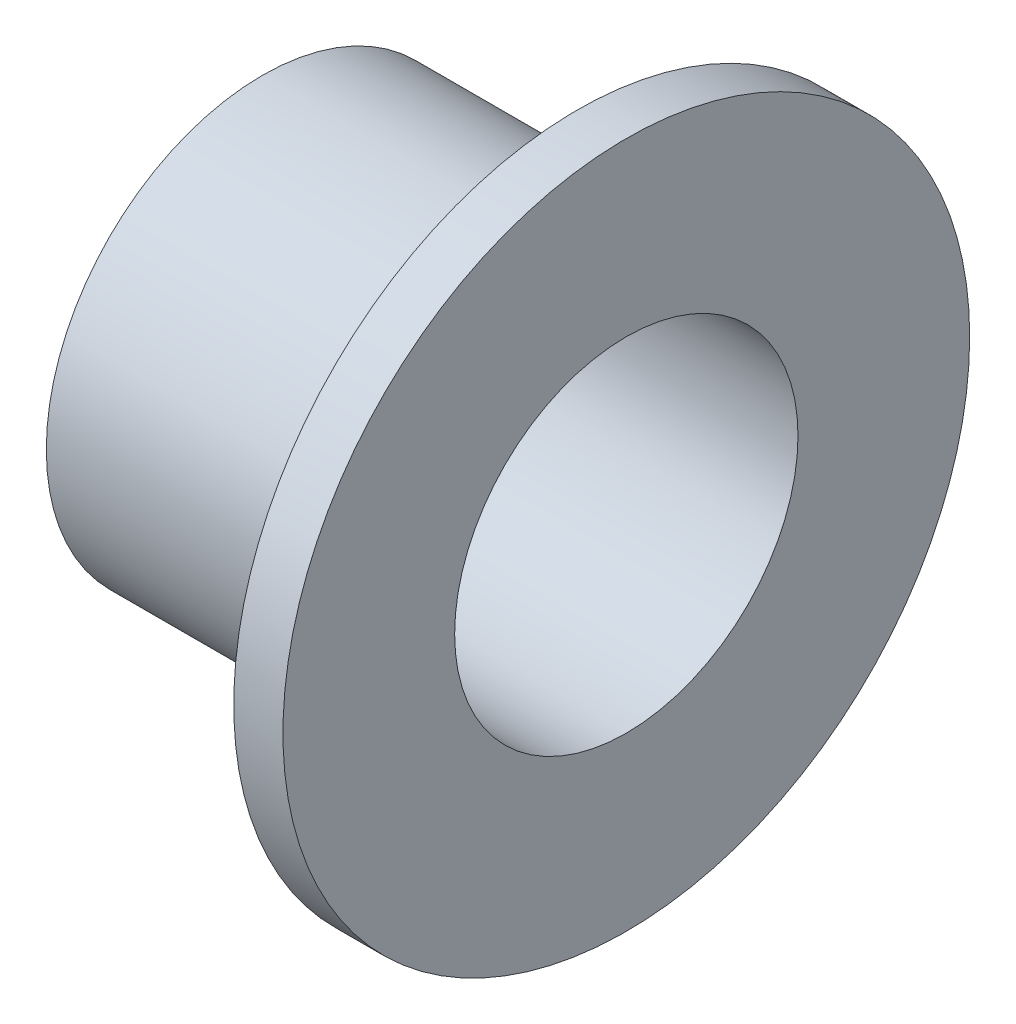
ISO-10303-21;
HEADER;
FILE_DESCRIPTION(('STEP AP214'),'2;1');
FILE_NAME('part.step','',(''),(''),'','','');
FILE_SCHEMA(('AUTOMOTIVE_DESIGN { 1 0 10303 214 1 1 1 1 }'));
ENDSEC;
DATA;
#1=APPLICATION_CONTEXT('core data for automotive mechanical design processes');
#2=APPLICATION_PROTOCOL_DEFINITION('international standard','automotive_design',2000,#1);
#3=PRODUCT_CONTEXT('',#1,'mechanical');
#4=PRODUCT('Part','Part','',(#3));
#5=PRODUCT_RELATED_PRODUCT_CATEGORY('part','',(#4));
#6=PRODUCT_DEFINITION_FORMATION('','',#4);
#7=PRODUCT_DEFINITION_CONTEXT('part definition',#1,'design');
#8=PRODUCT_DEFINITION('design','',#6,#7);
#9=PRODUCT_DEFINITION_SHAPE('','',#8);
#10=(LENGTH_UNIT() NAMED_UNIT(*) SI_UNIT(.MILLI.,.METRE.));
#11=(NAMED_UNIT(*) PLANE_ANGLE_UNIT() SI_UNIT($,.RADIAN.));
#12=(NAMED_UNIT(*) SI_UNIT($,.STERADIAN.) SOLID_ANGLE_UNIT());
#13=UNCERTAINTY_MEASURE_WITH_UNIT(LENGTH_MEASURE(1.E-05),#10,'distance_accuracy_value','');
#14=(GEOMETRIC_REPRESENTATION_CONTEXT(3) GLOBAL_UNCERTAINTY_ASSIGNED_CONTEXT((#13)) GLOBAL_UNIT_ASSIGNED_CONTEXT((#10,
#11,#12)) REPRESENTATION_CONTEXT('',''));
#15=CARTESIAN_POINT('',(0.,0.,0.));
#16=DIRECTION('',(0.,0.,1.));
#17=DIRECTION('',(1.,0.,0.));
#18=AXIS2_PLACEMENT_3D('',#15,#16,#17);
#19=CARTESIAN_POINT('',(5.50000000000006,6.66133814775094E-13,0.));
#20=DIRECTION('',(-1.,0.,0.));
#21=DIRECTION('',(0.,0.,1.));
#22=AXIS2_PLACEMENT_3D('',#19,#20,#21);
#23=CYLINDRICAL_SURFACE('',#22,3.775);
#24=CARTESIAN_POINT('',(5.50000000000006,6.66133814775094E-13,0.));
#25=DIRECTION('',(1.,0.,0.));
#26=DIRECTION('',(0.,0.,-1.));
#27=AXIS2_PLACEMENT_3D('',#24,#25,#26);
#28=CIRCLE('',#27,3.775);
#29=CARTESIAN_POINT('',(5.50000000000006,6.66133814775094E-13,-3.775));
#30=VERTEX_POINT('',#29);
#31=EDGE_CURVE('E10',#30,#30,#28,.T.);
#32=ORIENTED_EDGE('',*,*,#31,.F.);
#33=EDGE_LOOP('',(#32));
#34=FACE_BOUND('',#33,.T.);
#35=CARTESIAN_POINT('',(0.,0.,0.));
#36=DIRECTION('',(1.,0.,0.));
#37=DIRECTION('',(0.,0.,-1.));
#38=AXIS2_PLACEMENT_3D('',#35,#36,#37);
#39=CIRCLE('',#38,3.775);
#40=CARTESIAN_POINT('',(0.,0.,-3.775));
#41=VERTEX_POINT('',#40);
#42=EDGE_CURVE('E35',#41,#41,#39,.T.);
#43=ORIENTED_EDGE('',*,*,#42,.T.);
#44=EDGE_LOOP('',(#43));
#45=FACE_BOUND('',#44,.T.);
#46=ADVANCED_FACE('F32',(#34,#45),#23,.T.);
#47=CARTESIAN_POINT('',(0.,0.,0.));
#48=DIRECTION('',(1.,0.,0.));
#49=DIRECTION('',(0.,0.,-1.));
#50=AXIS2_PLACEMENT_3D('',#47,#48,#49);
#51=PLANE('',#50);
#52=CARTESIAN_POINT('',(0.,0.,0.));
#53=DIRECTION('',(1.,0.,0.));
#54=DIRECTION('',(0.,0.,-1.));
#55=AXIS2_PLACEMENT_3D('',#52,#53,#54);
#56=CIRCLE('',#55,3.);
#57=CARTESIAN_POINT('',(0.,0.,-3.));
#58=VERTEX_POINT('',#57);
#59=EDGE_CURVE('E47',#58,#58,#56,.T.);
#60=ORIENTED_EDGE('',*,*,#59,.T.);
#61=EDGE_LOOP('',(#60));
#62=FACE_BOUND('',#61,.T.);
#63=ORIENTED_EDGE('',*,*,#42,.F.);
#64=EDGE_LOOP('',(#63));
#65=FACE_BOUND('',#64,.T.);
#66=ADVANCED_FACE('F56',(#62,#65),#51,.F.);
#67=CARTESIAN_POINT('',(6.35999999999992,0.,0.));
#68=DIRECTION('',(-1.,0.,0.));
#69=DIRECTION('',(0.,0.,1.));
#70=AXIS2_PLACEMENT_3D('',#67,#68,#69);
#71=CYLINDRICAL_SURFACE('',#70,6.);
#72=CARTESIAN_POINT('',(6.35999999999992,0.,0.));
#73=DIRECTION('',(1.,0.,0.));
#74=DIRECTION('',(0.,0.,-1.));
#75=AXIS2_PLACEMENT_3D('',#72,#73,#74);
#76=CIRCLE('',#75,6.);
#77=CARTESIAN_POINT('',(6.35999999999992,0.,-6.));
#78=VERTEX_POINT('',#77);
#79=EDGE_CURVE('E42',#78,#78,#76,.T.);
#80=ORIENTED_EDGE('',*,*,#79,.F.);
#81=EDGE_LOOP('',(#80));
#82=FACE_BOUND('',#81,.T.);
#83=CARTESIAN_POINT('',(5.50000000000006,6.66133814775094E-13,0.));
#84=DIRECTION('',(1.,0.,0.));
#85=DIRECTION('',(0.,0.,-1.));
#86=AXIS2_PLACEMENT_3D('',#83,#84,#85);
#87=CIRCLE('',#86,6.);
#88=CARTESIAN_POINT('',(5.50000000000006,6.66133814775094E-13,-6.));
#89=VERTEX_POINT('',#88);
#90=EDGE_CURVE('E44',#89,#89,#87,.T.);
#91=ORIENTED_EDGE('',*,*,#90,.T.);
#92=EDGE_LOOP('',(#91));
#93=FACE_BOUND('',#92,.T.);
#94=ADVANCED_FACE('F69',(#82,#93),#71,.T.);
#95=CARTESIAN_POINT('',(6.35999999999992,0.,0.));
#96=DIRECTION('',(1.,0.,0.));
#97=DIRECTION('',(0.,0.,-1.));
#98=AXIS2_PLACEMENT_3D('',#95,#96,#97);
#99=PLANE('',#98);
#100=CARTESIAN_POINT('',(6.35999999999992,0.,0.));
#101=DIRECTION('',(1.,0.,0.));
#102=DIRECTION('',(0.,0.,-1.));
#103=AXIS2_PLACEMENT_3D('',#100,#101,#102);
#104=CIRCLE('',#103,3.);
#105=CARTESIAN_POINT('',(6.35999999999992,0.,-3.));
#106=VERTEX_POINT('',#105);
#107=EDGE_CURVE('E50',#106,#106,#104,.T.);
#108=ORIENTED_EDGE('',*,*,#107,.F.);
#109=EDGE_LOOP('',(#108));
#110=FACE_BOUND('',#109,.T.);
#111=ORIENTED_EDGE('',*,*,#79,.T.);
#112=EDGE_LOOP('',(#111));
#113=FACE_BOUND('',#112,.T.);
#114=ADVANCED_FACE('F66',(#110,#113),#99,.T.);
#115=CARTESIAN_POINT('',(5.50000000000006,6.66133814775094E-13,0.));
#116=DIRECTION('',(1.,0.,0.));
#117=DIRECTION('',(0.,0.,-1.));
#118=AXIS2_PLACEMENT_3D('',#115,#116,#117);
#119=PLANE('',#118);
#120=ORIENTED_EDGE('',*,*,#31,.T.);
#121=EDGE_LOOP('',(#120));
#122=FACE_BOUND('',#121,.T.);
#123=ORIENTED_EDGE('',*,*,#90,.F.);
#124=EDGE_LOOP('',(#123));
#125=FACE_BOUND('',#124,.T.);
#126=ADVANCED_FACE('F62',(#122,#125),#119,.F.);
#127=CARTESIAN_POINT('',(0.,0.,0.));
#128=DIRECTION('',(1.,0.,0.));
#129=DIRECTION('',(0.,0.,-1.));
#130=AXIS2_PLACEMENT_3D('',#127,#128,#129);
#131=CYLINDRICAL_SURFACE('',#130,3.);
#132=ORIENTED_EDGE('',*,*,#59,.F.);
#133=EDGE_LOOP('',(#132));
#134=FACE_BOUND('',#133,.T.);
#135=ORIENTED_EDGE('',*,*,#107,.T.);
#136=EDGE_LOOP('',(#135));
#137=FACE_BOUND('',#136,.T.);
#138=ADVANCED_FACE('F59',(#134,#137),#131,.F.);
#139=CLOSED_SHELL('',(#46,#66,#94,#114,#126,#138));
#140=MANIFOLD_SOLID_BREP('B2',#139);
#141=ADVANCED_BREP_SHAPE_REPRESENTATION('',(#18,#140),#14);
#142=SHAPE_DEFINITION_REPRESENTATION(#9,#141);
ENDSEC;
END-ISO-10303-21;
